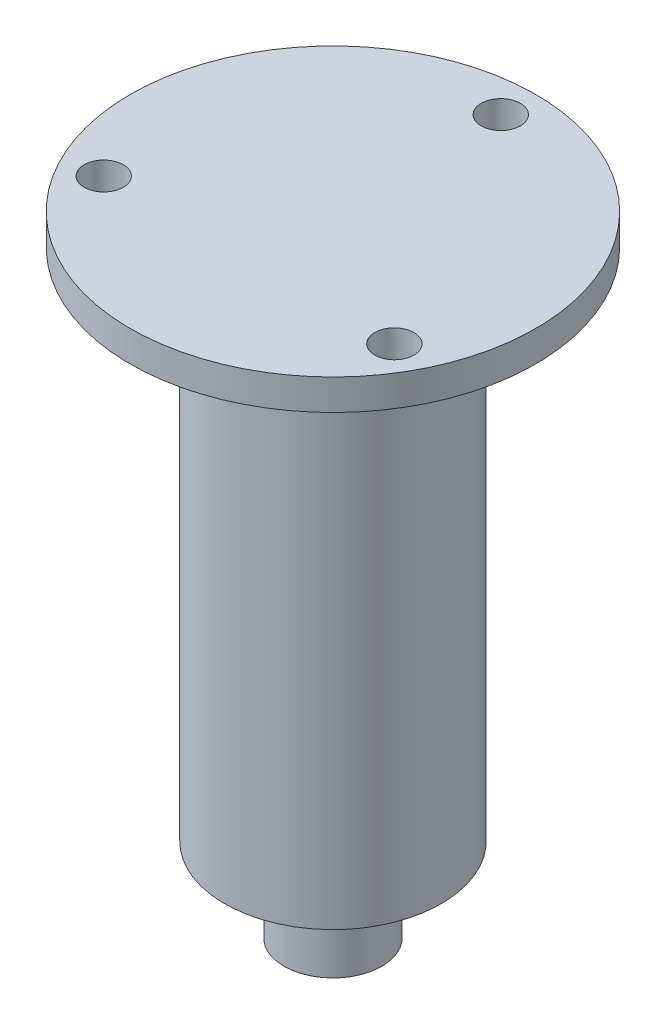
ISO-10303-21;
HEADER;
FILE_DESCRIPTION(('STEP AP214'),'2;1');
FILE_NAME('part.step','',(''),(''),'','','');
FILE_SCHEMA(('AUTOMOTIVE_DESIGN { 1 0 10303 214 1 1 1 1 }'));
ENDSEC;
DATA;
#1=APPLICATION_CONTEXT('core data for automotive mechanical design processes');
#2=APPLICATION_PROTOCOL_DEFINITION('international standard','automotive_design',2000,#1);
#3=PRODUCT_CONTEXT('',#1,'mechanical');
#4=PRODUCT('Part','Part','',(#3));
#5=PRODUCT_RELATED_PRODUCT_CATEGORY('part','',(#4));
#6=PRODUCT_DEFINITION_FORMATION('','',#4);
#7=PRODUCT_DEFINITION_CONTEXT('part definition',#1,'design');
#8=PRODUCT_DEFINITION('design','',#6,#7);
#9=PRODUCT_DEFINITION_SHAPE('','',#8);
#10=(LENGTH_UNIT() NAMED_UNIT(*) SI_UNIT(.MILLI.,.METRE.));
#11=(NAMED_UNIT(*) PLANE_ANGLE_UNIT() SI_UNIT($,.RADIAN.));
#12=(NAMED_UNIT(*) SI_UNIT($,.STERADIAN.) SOLID_ANGLE_UNIT());
#13=UNCERTAINTY_MEASURE_WITH_UNIT(LENGTH_MEASURE(1.E-05),#10,'distance_accuracy_value','');
#14=(GEOMETRIC_REPRESENTATION_CONTEXT(3) GLOBAL_UNCERTAINTY_ASSIGNED_CONTEXT((#13)) GLOBAL_UNIT_ASSIGNED_CONTEXT((#10,
#11,#12)) REPRESENTATION_CONTEXT('',''));
#15=CARTESIAN_POINT('',(0.,0.,0.));
#16=DIRECTION('',(0.,0.,1.));
#17=DIRECTION('',(1.,0.,0.));
#18=AXIS2_PLACEMENT_3D('',#15,#16,#17);
#19=CARTESIAN_POINT('',(0.,0.,0.));
#20=DIRECTION('',(0.,-1.,0.));
#21=DIRECTION('',(1.,0.,0.));
#22=AXIS2_PLACEMENT_3D('',#19,#20,#21);
#23=PLANE('',#22);
#24=CARTESIAN_POINT('',(0.,0.,0.));
#25=DIRECTION('',(0.,1.,0.));
#26=DIRECTION('',(-1.,0.,0.));
#27=AXIS2_PLACEMENT_3D('',#24,#25,#26);
#28=CIRCLE('',#27,3.5);
#29=CARTESIAN_POINT('',(-3.5,0.,0.));
#30=VERTEX_POINT('',#29);
#31=EDGE_CURVE('E10',#30,#30,#28,.T.);
#32=ORIENTED_EDGE('',*,*,#31,.F.);
#33=EDGE_LOOP('',(#32));
#34=FACE_BOUND('',#33,.T.);
#35=ADVANCED_FACE('F41',(#34),#23,.T.);
#36=CARTESIAN_POINT('',(0.,45.,0.));
#37=DIRECTION('',(0.,1.,0.));
#38=DIRECTION('',(-1.,0.,0.));
#39=AXIS2_PLACEMENT_3D('',#36,#37,#38);
#40=CYLINDRICAL_SURFACE('',#39,3.5);
#41=ORIENTED_EDGE('',*,*,#31,.T.);
#42=EDGE_LOOP('',(#41));
#43=FACE_BOUND('',#42,.T.);
#44=CARTESIAN_POINT('',(0.,6.,0.));
#45=DIRECTION('',(0.,1.,0.));
#46=DIRECTION('',(-1.,0.,0.));
#47=AXIS2_PLACEMENT_3D('',#44,#45,#46);
#48=CIRCLE('',#47,3.5);
#49=CARTESIAN_POINT('',(-3.5,6.,0.));
#50=VERTEX_POINT('',#49);
#51=EDGE_CURVE('E47',#50,#50,#48,.T.);
#52=ORIENTED_EDGE('',*,*,#51,.F.);
#53=EDGE_LOOP('',(#52));
#54=FACE_BOUND('',#53,.T.);
#55=ADVANCED_FACE('F111',(#43,#54),#40,.T.);
#56=CARTESIAN_POINT('',(-3.5,6.,0.));
#57=DIRECTION('',(0.,-1.,0.));
#58=DIRECTION('',(1.,0.,0.));
#59=AXIS2_PLACEMENT_3D('',#56,#57,#58);
#60=PLANE('',#59);
#61=ORIENTED_EDGE('',*,*,#51,.T.);
#62=EDGE_LOOP('',(#61));
#63=FACE_BOUND('',#62,.T.);
#64=CARTESIAN_POINT('',(0.,6.,0.));
#65=DIRECTION('',(0.,1.,0.));
#66=DIRECTION('',(-1.,0.,0.));
#67=AXIS2_PLACEMENT_3D('',#64,#65,#66);
#68=CIRCLE('',#67,7.74999999999999);
#69=CARTESIAN_POINT('',(-7.74999999999999,6.,0.));
#70=VERTEX_POINT('',#69);
#71=EDGE_CURVE('E51',#70,#70,#68,.T.);
#72=ORIENTED_EDGE('',*,*,#71,.F.);
#73=EDGE_LOOP('',(#72));
#74=FACE_BOUND('',#73,.T.);
#75=ADVANCED_FACE('F116',(#63,#74),#60,.T.);
#76=CARTESIAN_POINT('',(0.,45.,0.));
#77=DIRECTION('',(0.,1.,0.));
#78=DIRECTION('',(-1.,0.,0.));
#79=AXIS2_PLACEMENT_3D('',#76,#77,#78);
#80=CYLINDRICAL_SURFACE('',#79,7.74999999999999);
#81=ORIENTED_EDGE('',*,*,#71,.T.);
#82=EDGE_LOOP('',(#81));
#83=FACE_BOUND('',#82,.T.);
#84=CARTESIAN_POINT('',(0.,42.8,0.));
#85=DIRECTION('',(0.,1.,0.));
#86=DIRECTION('',(-1.,0.,0.));
#87=AXIS2_PLACEMENT_3D('',#84,#85,#86);
#88=CIRCLE('',#87,7.74999999999999);
#89=CARTESIAN_POINT('',(-7.74999999999999,42.8,0.));
#90=VERTEX_POINT('',#89);
#91=EDGE_CURVE('E55',#90,#90,#88,.T.);
#92=ORIENTED_EDGE('',*,*,#91,.F.);
#93=EDGE_LOOP('',(#92));
#94=FACE_BOUND('',#93,.T.);
#95=ADVANCED_FACE('F107',(#83,#94),#80,.T.);
#96=CARTESIAN_POINT('',(-7.74999999999999,42.8,0.));
#97=DIRECTION('',(0.,-1.,0.));
#98=DIRECTION('',(1.,0.,0.));
#99=AXIS2_PLACEMENT_3D('',#96,#97,#98);
#100=PLANE('',#99);
#101=CARTESIAN_POINT('',(0.,42.8,-12.));
#102=DIRECTION('',(0.,-1.,0.));
#103=DIRECTION('',(1.,0.,0.));
#104=AXIS2_PLACEMENT_3D('',#101,#102,#103);
#105=CIRCLE('',#104,1.4);
#106=CARTESIAN_POINT('',(-1.4,42.8,-12.));
#107=VERTEX_POINT('',#106);
#108=EDGE_CURVE('E66',#107,#107,#105,.T.);
#109=ORIENTED_EDGE('',*,*,#108,.F.);
#110=EDGE_LOOP('',(#109));
#111=FACE_BOUND('',#110,.T.);
#112=CARTESIAN_POINT('',(10.3923048454133,42.8,6.));
#113=DIRECTION('',(0.,-1.,0.));
#114=DIRECTION('',(1.,0.,0.));
#115=AXIS2_PLACEMENT_3D('',#112,#113,#114);
#116=CIRCLE('',#115,1.4);
#117=CARTESIAN_POINT('',(8.99230484541327,42.8,6.));
#118=VERTEX_POINT('',#117);
#119=EDGE_CURVE('E69',#118,#118,#116,.T.);
#120=ORIENTED_EDGE('',*,*,#119,.F.);
#121=EDGE_LOOP('',(#120));
#122=FACE_BOUND('',#121,.T.);
#123=CARTESIAN_POINT('',(-10.3923048454133,42.8,6.));
#124=DIRECTION('',(0.,-1.,0.));
#125=DIRECTION('',(1.,0.,0.));
#126=AXIS2_PLACEMENT_3D('',#123,#124,#125);
#127=CIRCLE('',#126,1.4);
#128=CARTESIAN_POINT('',(-11.7923048454133,42.8,6.));
#129=VERTEX_POINT('',#128);
#130=EDGE_CURVE('E72',#129,#129,#127,.T.);
#131=ORIENTED_EDGE('',*,*,#130,.F.);
#132=EDGE_LOOP('',(#131));
#133=FACE_BOUND('',#132,.T.);
#134=ORIENTED_EDGE('',*,*,#91,.T.);
#135=EDGE_LOOP('',(#134));
#136=FACE_BOUND('',#135,.T.);
#137=CARTESIAN_POINT('',(0.,42.8,0.));
#138=DIRECTION('',(0.,1.,0.));
#139=DIRECTION('',(-1.,0.,0.));
#140=AXIS2_PLACEMENT_3D('',#137,#138,#139);
#141=CIRCLE('',#140,14.5);
#142=CARTESIAN_POINT('',(-14.5,42.8,0.));
#143=VERTEX_POINT('',#142);
#144=EDGE_CURVE('E60',#143,#143,#141,.T.);
#145=ORIENTED_EDGE('',*,*,#144,.F.);
#146=EDGE_LOOP('',(#145));
#147=FACE_BOUND('',#146,.T.);
#148=ADVANCED_FACE('F100',(#111,#122,#133,#136,#147),#100,.T.);
#149=CARTESIAN_POINT('',(0.,45.,0.));
#150=DIRECTION('',(0.,1.,0.));
#151=DIRECTION('',(-1.,0.,0.));
#152=AXIS2_PLACEMENT_3D('',#149,#150,#151);
#153=CYLINDRICAL_SURFACE('',#152,14.5);
#154=ORIENTED_EDGE('',*,*,#144,.T.);
#155=EDGE_LOOP('',(#154));
#156=FACE_BOUND('',#155,.T.);
#157=CARTESIAN_POINT('',(0.,45.,0.));
#158=DIRECTION('',(0.,1.,0.));
#159=DIRECTION('',(-1.,0.,0.));
#160=AXIS2_PLACEMENT_3D('',#157,#158,#159);
#161=CIRCLE('',#160,14.5);
#162=CARTESIAN_POINT('',(-14.5,45.,0.));
#163=VERTEX_POINT('',#162);
#164=EDGE_CURVE('E63',#163,#163,#161,.T.);
#165=ORIENTED_EDGE('',*,*,#164,.F.);
#166=EDGE_LOOP('',(#165));
#167=FACE_BOUND('',#166,.T.);
#168=ADVANCED_FACE('F91',(#156,#167),#153,.T.);
#169=CARTESIAN_POINT('',(-14.5,45.,0.));
#170=DIRECTION('',(0.,1.,0.));
#171=DIRECTION('',(-1.,0.,0.));
#172=AXIS2_PLACEMENT_3D('',#169,#170,#171);
#173=PLANE('',#172);
#174=CARTESIAN_POINT('',(0.,45.,-12.));
#175=DIRECTION('',(0.,1.,0.));
#176=DIRECTION('',(-1.,0.,0.));
#177=AXIS2_PLACEMENT_3D('',#174,#175,#176);
#178=CIRCLE('',#177,1.4);
#179=CARTESIAN_POINT('',(-1.4,45.,-12.));
#180=VERTEX_POINT('',#179);
#181=EDGE_CURVE('E75',#180,#180,#178,.T.);
#182=ORIENTED_EDGE('',*,*,#181,.F.);
#183=EDGE_LOOP('',(#182));
#184=FACE_BOUND('',#183,.T.);
#185=CARTESIAN_POINT('',(10.3923048454133,45.,6.));
#186=DIRECTION('',(0.,1.,0.));
#187=DIRECTION('',(-1.,0.,0.));
#188=AXIS2_PLACEMENT_3D('',#185,#186,#187);
#189=CIRCLE('',#188,1.4);
#190=CARTESIAN_POINT('',(8.99230484541327,45.,6.));
#191=VERTEX_POINT('',#190);
#192=EDGE_CURVE('E79',#191,#191,#189,.T.);
#193=ORIENTED_EDGE('',*,*,#192,.F.);
#194=EDGE_LOOP('',(#193));
#195=FACE_BOUND('',#194,.T.);
#196=CARTESIAN_POINT('',(-10.3923048454133,45.,6.));
#197=DIRECTION('',(0.,1.,0.));
#198=DIRECTION('',(-1.,0.,0.));
#199=AXIS2_PLACEMENT_3D('',#196,#197,#198);
#200=CIRCLE('',#199,1.4);
#201=CARTESIAN_POINT('',(-11.7923048454133,45.,6.));
#202=VERTEX_POINT('',#201);
#203=EDGE_CURVE('E76',#202,#202,#200,.T.);
#204=ORIENTED_EDGE('',*,*,#203,.F.);
#205=EDGE_LOOP('',(#204));
#206=FACE_BOUND('',#205,.T.);
#207=ORIENTED_EDGE('',*,*,#164,.T.);
#208=EDGE_LOOP('',(#207));
#209=FACE_BOUND('',#208,.T.);
#210=ADVANCED_FACE('F87',(#184,#195,#206,#209),#173,.T.);
#211=CARTESIAN_POINT('',(-10.3923048454133,0.,6.));
#212=DIRECTION('',(0.,1.,0.));
#213=DIRECTION('',(-1.,0.,0.));
#214=AXIS2_PLACEMENT_3D('',#211,#212,#213);
#215=CYLINDRICAL_SURFACE('',#214,1.4);
#216=CARTESIAN_POINT('',(-11.7923048454133,42.8,6.));
#217=CARTESIAN_POINT('',(-11.7923048454133,42.8229166666667,6.));
#218=CARTESIAN_POINT('',(-11.7923048454133,42.8458333333333,6.));
#219=CARTESIAN_POINT('',(-11.7923048454133,42.8916666666667,6.));
#220=CARTESIAN_POINT('',(-11.7923048454133,42.9145833333333,6.));
#221=CARTESIAN_POINT('',(-11.7923048454133,42.9604166666667,6.));
#222=CARTESIAN_POINT('',(-11.7923048454133,42.9833333333333,6.));
#223=CARTESIAN_POINT('',(-11.7923048454133,43.0291666666667,6.));
#224=CARTESIAN_POINT('',(-11.7923048454133,43.0520833333333,6.));
#225=CARTESIAN_POINT('',(-11.7923048454133,43.0979166666667,6.));
#226=CARTESIAN_POINT('',(-11.7923048454133,43.1208333333333,6.));
#227=CARTESIAN_POINT('',(-11.7923048454133,43.1666666666667,6.));
#228=CARTESIAN_POINT('',(-11.7923048454133,43.1895833333333,6.));
#229=CARTESIAN_POINT('',(-11.7923048454133,43.2354166666667,6.));
#230=CARTESIAN_POINT('',(-11.7923048454133,43.2583333333333,6.));
#231=CARTESIAN_POINT('',(-11.7923048454133,43.3041666666667,6.));
#232=CARTESIAN_POINT('',(-11.7923048454133,43.3270833333333,6.));
#233=CARTESIAN_POINT('',(-11.7923048454133,43.3729166666667,6.));
#234=CARTESIAN_POINT('',(-11.7923048454133,43.3958333333333,6.));
#235=CARTESIAN_POINT('',(-11.7923048454133,43.4416666666667,6.));
#236=CARTESIAN_POINT('',(-11.7923048454133,43.4645833333333,6.));
#237=CARTESIAN_POINT('',(-11.7923048454133,43.5104166666667,6.));
#238=CARTESIAN_POINT('',(-11.7923048454133,43.5333333333333,6.));
#239=CARTESIAN_POINT('',(-11.7923048454133,43.5791666666667,6.));
#240=CARTESIAN_POINT('',(-11.7923048454133,43.6020833333333,6.));
#241=CARTESIAN_POINT('',(-11.7923048454133,43.6479166666667,6.));
#242=CARTESIAN_POINT('',(-11.7923048454133,43.6708333333333,6.));
#243=CARTESIAN_POINT('',(-11.7923048454133,43.7166666666667,6.));
#244=CARTESIAN_POINT('',(-11.7923048454133,43.7395833333333,6.));
#245=CARTESIAN_POINT('',(-11.7923048454133,43.7854166666667,6.));
#246=CARTESIAN_POINT('',(-11.7923048454133,43.8083333333333,6.));
#247=CARTESIAN_POINT('',(-11.7923048454133,43.8541666666667,6.));
#248=CARTESIAN_POINT('',(-11.7923048454133,43.8770833333333,6.));
#249=CARTESIAN_POINT('',(-11.7923048454133,43.9229166666667,6.));
#250=CARTESIAN_POINT('',(-11.7923048454133,43.9458333333333,6.));
#251=CARTESIAN_POINT('',(-11.7923048454133,43.9916666666667,6.));
#252=CARTESIAN_POINT('',(-11.7923048454133,44.0145833333333,6.));
#253=CARTESIAN_POINT('',(-11.7923048454133,44.0604166666667,6.));
#254=CARTESIAN_POINT('',(-11.7923048454133,44.0833333333333,6.));
#255=CARTESIAN_POINT('',(-11.7923048454133,44.1291666666667,6.));
#256=CARTESIAN_POINT('',(-11.7923048454133,44.1520833333333,6.));
#257=CARTESIAN_POINT('',(-11.7923048454133,44.1979166666667,6.));
#258=CARTESIAN_POINT('',(-11.7923048454133,44.2208333333333,6.));
#259=CARTESIAN_POINT('',(-11.7923048454133,44.2666666666667,6.));
#260=CARTESIAN_POINT('',(-11.7923048454133,44.2895833333333,6.));
#261=CARTESIAN_POINT('',(-11.7923048454133,44.3354166666667,6.));
#262=CARTESIAN_POINT('',(-11.7923048454133,44.3583333333333,6.));
#263=CARTESIAN_POINT('',(-11.7923048454133,44.4041666666667,6.));
#264=CARTESIAN_POINT('',(-11.7923048454133,44.4270833333333,6.));
#265=CARTESIAN_POINT('',(-11.7923048454133,44.4729166666667,6.));
#266=CARTESIAN_POINT('',(-11.7923048454133,44.4958333333333,6.));
#267=CARTESIAN_POINT('',(-11.7923048454133,44.5416666666667,6.));
#268=CARTESIAN_POINT('',(-11.7923048454133,44.5645833333333,6.));
#269=CARTESIAN_POINT('',(-11.7923048454133,44.6104166666667,6.));
#270=CARTESIAN_POINT('',(-11.7923048454133,44.6333333333333,6.));
#271=CARTESIAN_POINT('',(-11.7923048454133,44.6791666666667,6.));
#272=CARTESIAN_POINT('',(-11.7923048454133,44.7020833333333,6.));
#273=CARTESIAN_POINT('',(-11.7923048454133,44.7479166666667,6.));
#274=CARTESIAN_POINT('',(-11.7923048454133,44.7708333333333,6.));
#275=CARTESIAN_POINT('',(-11.7923048454133,44.8166666666667,6.));
#276=CARTESIAN_POINT('',(-11.7923048454133,44.8395833333333,6.));
#277=CARTESIAN_POINT('',(-11.7923048454133,44.8854166666667,6.));
#278=CARTESIAN_POINT('',(-11.7923048454133,44.9083333333333,6.));
#279=CARTESIAN_POINT('',(-11.7923048454133,44.9541666666667,6.));
#280=CARTESIAN_POINT('',(-11.7923048454133,44.9770833333333,6.));
#281=CARTESIAN_POINT('',(-11.7923048454133,45.,6.));
#282=B_SPLINE_CURVE_WITH_KNOTS('',3,(#216,#217,#218,#219,#220,#221,#222,#223,#224,#225,#226,
#227,#228,#229,#230,#231,#232,#233,#234,#235,#236,#237,#238,#239,#240,#241,#242,#243,#244,#245,
#246,#247,#248,#249,#250,#251,#252,#253,#254,#255,#256,#257,#258,#259,#260,#261,#262,#263,#264,
#265,#266,#267,#268,#269,#270,#271,#272,#273,#274,#275,#276,#277,#278,#279,#280,#281),
.UNSPECIFIED.,.F.,.F.,(4,2,2,2,2,2,2,2,2,2,2,2,2,2,2,2,2,2,2,2,2,2,2,2,2,2,2,2,2,2,2,2,4),(0.,
0.0687499999999994,0.137499999999999,0.206249999999998,0.274999999999997,0.343749999999997,
0.412499999999996,0.481249999999996,0.549999999999995,0.618750000000001,0.687500000000001,
0.75625,0.824999999999999,0.893749999999999,0.962499999999998,1.03125,1.1,1.16875,1.2375,
1.30625,1.37499999999999,1.44374999999999,1.51249999999999,1.58124999999999,1.65,1.71875,1.7875,
1.85625,1.925,1.99375,2.06249999999999,2.13124999999999,2.19999999999999),.UNSPECIFIED.);
#283=EDGE_CURVE('BSEAM90',#129,#202,#282,.T.);
#284=ORIENTED_EDGE('',*,*,#130,.T.);
#285=ORIENTED_EDGE('',*,*,#203,.T.);
#286=ORIENTED_EDGE('',*,*,#283,.T.);
#287=ORIENTED_EDGE('',*,*,#283,.F.);
#288=EDGE_LOOP('',(#284,#286,#285,#287));
#289=FACE_BOUND('',#288,.T.);
#290=ADVANCED_FACE('F90',(#289),#215,.F.);
#291=CARTESIAN_POINT('',(10.3923048454133,0.,6.));
#292=DIRECTION('',(0.,1.,0.));
#293=DIRECTION('',(-1.,0.,0.));
#294=AXIS2_PLACEMENT_3D('',#291,#292,#293);
#295=CYLINDRICAL_SURFACE('',#294,1.4);
#296=CARTESIAN_POINT('',(8.99230484541327,42.8,6.));
#297=CARTESIAN_POINT('',(8.99230484541327,42.8229166666667,6.));
#298=CARTESIAN_POINT('',(8.99230484541327,42.8458333333333,6.));
#299=CARTESIAN_POINT('',(8.99230484541327,42.8916666666667,6.));
#300=CARTESIAN_POINT('',(8.99230484541327,42.9145833333333,6.));
#301=CARTESIAN_POINT('',(8.99230484541327,42.9604166666667,6.));
#302=CARTESIAN_POINT('',(8.99230484541327,42.9833333333333,6.));
#303=CARTESIAN_POINT('',(8.99230484541327,43.0291666666667,6.));
#304=CARTESIAN_POINT('',(8.99230484541327,43.0520833333333,6.));
#305=CARTESIAN_POINT('',(8.99230484541327,43.0979166666667,6.));
#306=CARTESIAN_POINT('',(8.99230484541327,43.1208333333333,6.));
#307=CARTESIAN_POINT('',(8.99230484541327,43.1666666666667,6.));
#308=CARTESIAN_POINT('',(8.99230484541327,43.1895833333333,6.));
#309=CARTESIAN_POINT('',(8.99230484541327,43.2354166666667,6.));
#310=CARTESIAN_POINT('',(8.99230484541327,43.2583333333333,6.));
#311=CARTESIAN_POINT('',(8.99230484541327,43.3041666666667,6.));
#312=CARTESIAN_POINT('',(8.99230484541327,43.3270833333333,6.));
#313=CARTESIAN_POINT('',(8.99230484541327,43.3729166666667,6.));
#314=CARTESIAN_POINT('',(8.99230484541327,43.3958333333333,6.));
#315=CARTESIAN_POINT('',(8.99230484541327,43.4416666666667,6.));
#316=CARTESIAN_POINT('',(8.99230484541327,43.4645833333333,6.));
#317=CARTESIAN_POINT('',(8.99230484541327,43.5104166666667,6.));
#318=CARTESIAN_POINT('',(8.99230484541327,43.5333333333333,6.));
#319=CARTESIAN_POINT('',(8.99230484541327,43.5791666666667,6.));
#320=CARTESIAN_POINT('',(8.99230484541327,43.6020833333333,6.));
#321=CARTESIAN_POINT('',(8.99230484541327,43.6479166666667,6.));
#322=CARTESIAN_POINT('',(8.99230484541327,43.6708333333333,6.));
#323=CARTESIAN_POINT('',(8.99230484541327,43.7166666666667,6.));
#324=CARTESIAN_POINT('',(8.99230484541327,43.7395833333333,6.));
#325=CARTESIAN_POINT('',(8.99230484541327,43.7854166666667,6.));
#326=CARTESIAN_POINT('',(8.99230484541327,43.8083333333333,6.));
#327=CARTESIAN_POINT('',(8.99230484541327,43.8541666666667,6.));
#328=CARTESIAN_POINT('',(8.99230484541327,43.8770833333333,6.));
#329=CARTESIAN_POINT('',(8.99230484541327,43.9229166666667,6.));
#330=CARTESIAN_POINT('',(8.99230484541327,43.9458333333333,6.));
#331=CARTESIAN_POINT('',(8.99230484541327,43.9916666666667,6.));
#332=CARTESIAN_POINT('',(8.99230484541327,44.0145833333333,6.));
#333=CARTESIAN_POINT('',(8.99230484541327,44.0604166666667,6.));
#334=CARTESIAN_POINT('',(8.99230484541327,44.0833333333333,6.));
#335=CARTESIAN_POINT('',(8.99230484541327,44.1291666666667,6.));
#336=CARTESIAN_POINT('',(8.99230484541327,44.1520833333333,6.));
#337=CARTESIAN_POINT('',(8.99230484541327,44.1979166666667,6.));
#338=CARTESIAN_POINT('',(8.99230484541327,44.2208333333333,6.));
#339=CARTESIAN_POINT('',(8.99230484541327,44.2666666666667,6.));
#340=CARTESIAN_POINT('',(8.99230484541327,44.2895833333333,6.));
#341=CARTESIAN_POINT('',(8.99230484541327,44.3354166666667,6.));
#342=CARTESIAN_POINT('',(8.99230484541327,44.3583333333333,6.));
#343=CARTESIAN_POINT('',(8.99230484541327,44.4041666666667,6.));
#344=CARTESIAN_POINT('',(8.99230484541327,44.4270833333333,6.));
#345=CARTESIAN_POINT('',(8.99230484541327,44.4729166666667,6.));
#346=CARTESIAN_POINT('',(8.99230484541327,44.4958333333333,6.));
#347=CARTESIAN_POINT('',(8.99230484541327,44.5416666666667,6.));
#348=CARTESIAN_POINT('',(8.99230484541327,44.5645833333333,6.));
#349=CARTESIAN_POINT('',(8.99230484541327,44.6104166666667,6.));
#350=CARTESIAN_POINT('',(8.99230484541327,44.6333333333333,6.));
#351=CARTESIAN_POINT('',(8.99230484541327,44.6791666666667,6.));
#352=CARTESIAN_POINT('',(8.99230484541327,44.7020833333333,6.));
#353=CARTESIAN_POINT('',(8.99230484541327,44.7479166666667,6.));
#354=CARTESIAN_POINT('',(8.99230484541327,44.7708333333333,6.));
#355=CARTESIAN_POINT('',(8.99230484541327,44.8166666666667,6.));
#356=CARTESIAN_POINT('',(8.99230484541327,44.8395833333333,6.));
#357=CARTESIAN_POINT('',(8.99230484541327,44.8854166666667,6.));
#358=CARTESIAN_POINT('',(8.99230484541327,44.9083333333333,6.));
#359=CARTESIAN_POINT('',(8.99230484541327,44.9541666666667,6.));
#360=CARTESIAN_POINT('',(8.99230484541327,44.9770833333333,6.));
#361=CARTESIAN_POINT('',(8.99230484541327,45.,6.));
#362=B_SPLINE_CURVE_WITH_KNOTS('',3,(#296,#297,#298,#299,#300,#301,#302,#303,#304,#305,#306,
#307,#308,#309,#310,#311,#312,#313,#314,#315,#316,#317,#318,#319,#320,#321,#322,#323,#324,#325,
#326,#327,#328,#329,#330,#331,#332,#333,#334,#335,#336,#337,#338,#339,#340,#341,#342,#343,#344,
#345,#346,#347,#348,#349,#350,#351,#352,#353,#354,#355,#356,#357,#358,#359,#360,#361),
.UNSPECIFIED.,.F.,.F.,(4,2,2,2,2,2,2,2,2,2,2,2,2,2,2,2,2,2,2,2,2,2,2,2,2,2,2,2,2,2,2,2,4),(0.,
0.0687499999999994,0.137499999999999,0.206249999999998,0.274999999999997,0.343749999999997,
0.412499999999996,0.481249999999996,0.549999999999995,0.618750000000001,0.687500000000001,
0.75625,0.824999999999999,0.893749999999999,0.962499999999998,1.03125,1.1,1.16875,1.2375,
1.30625,1.37499999999999,1.44374999999999,1.51249999999999,1.58124999999999,1.65,1.71875,1.7875,
1.85625,1.925,1.99375,2.06249999999999,2.13124999999999,2.19999999999999),.UNSPECIFIED.);
#363=EDGE_CURVE('BSEAM171',#118,#191,#362,.T.);
#364=ORIENTED_EDGE('',*,*,#119,.T.);
#365=ORIENTED_EDGE('',*,*,#192,.T.);
#366=ORIENTED_EDGE('',*,*,#363,.T.);
#367=ORIENTED_EDGE('',*,*,#363,.F.);
#368=EDGE_LOOP('',(#364,#366,#365,#367));
#369=FACE_BOUND('',#368,.T.);
#370=ADVANCED_FACE('F171',(#369),#295,.F.);
#371=CARTESIAN_POINT('',(0.,0.,-12.));
#372=DIRECTION('',(0.,1.,0.));
#373=DIRECTION('',(-1.,0.,0.));
#374=AXIS2_PLACEMENT_3D('',#371,#372,#373);
#375=CYLINDRICAL_SURFACE('',#374,1.4);
#376=CARTESIAN_POINT('',(-1.4,42.8,-12.));
#377=CARTESIAN_POINT('',(-1.4,42.8229166666667,-12.));
#378=CARTESIAN_POINT('',(-1.4,42.8458333333333,-12.));
#379=CARTESIAN_POINT('',(-1.4,42.8916666666667,-12.));
#380=CARTESIAN_POINT('',(-1.4,42.9145833333333,-12.));
#381=CARTESIAN_POINT('',(-1.4,42.9604166666667,-12.));
#382=CARTESIAN_POINT('',(-1.4,42.9833333333333,-12.));
#383=CARTESIAN_POINT('',(-1.4,43.0291666666667,-12.));
#384=CARTESIAN_POINT('',(-1.4,43.0520833333333,-12.));
#385=CARTESIAN_POINT('',(-1.4,43.0979166666667,-12.));
#386=CARTESIAN_POINT('',(-1.4,43.1208333333333,-12.));
#387=CARTESIAN_POINT('',(-1.4,43.1666666666667,-12.));
#388=CARTESIAN_POINT('',(-1.4,43.1895833333333,-12.));
#389=CARTESIAN_POINT('',(-1.4,43.2354166666667,-12.));
#390=CARTESIAN_POINT('',(-1.4,43.2583333333333,-12.));
#391=CARTESIAN_POINT('',(-1.4,43.3041666666667,-12.));
#392=CARTESIAN_POINT('',(-1.4,43.3270833333333,-12.));
#393=CARTESIAN_POINT('',(-1.4,43.3729166666667,-12.));
#394=CARTESIAN_POINT('',(-1.4,43.3958333333333,-12.));
#395=CARTESIAN_POINT('',(-1.4,43.4416666666667,-12.));
#396=CARTESIAN_POINT('',(-1.4,43.4645833333333,-12.));
#397=CARTESIAN_POINT('',(-1.4,43.5104166666667,-12.));
#398=CARTESIAN_POINT('',(-1.4,43.5333333333333,-12.));
#399=CARTESIAN_POINT('',(-1.4,43.5791666666667,-12.));
#400=CARTESIAN_POINT('',(-1.4,43.6020833333333,-12.));
#401=CARTESIAN_POINT('',(-1.4,43.6479166666667,-12.));
#402=CARTESIAN_POINT('',(-1.4,43.6708333333333,-12.));
#403=CARTESIAN_POINT('',(-1.4,43.7166666666667,-12.));
#404=CARTESIAN_POINT('',(-1.4,43.7395833333333,-12.));
#405=CARTESIAN_POINT('',(-1.4,43.7854166666667,-12.));
#406=CARTESIAN_POINT('',(-1.4,43.8083333333333,-12.));
#407=CARTESIAN_POINT('',(-1.4,43.8541666666667,-12.));
#408=CARTESIAN_POINT('',(-1.4,43.8770833333333,-12.));
#409=CARTESIAN_POINT('',(-1.4,43.9229166666667,-12.));
#410=CARTESIAN_POINT('',(-1.4,43.9458333333333,-12.));
#411=CARTESIAN_POINT('',(-1.4,43.9916666666667,-12.));
#412=CARTESIAN_POINT('',(-1.4,44.0145833333333,-12.));
#413=CARTESIAN_POINT('',(-1.4,44.0604166666667,-12.));
#414=CARTESIAN_POINT('',(-1.4,44.0833333333333,-12.));
#415=CARTESIAN_POINT('',(-1.4,44.1291666666667,-12.));
#416=CARTESIAN_POINT('',(-1.4,44.1520833333333,-12.));
#417=CARTESIAN_POINT('',(-1.4,44.1979166666667,-12.));
#418=CARTESIAN_POINT('',(-1.4,44.2208333333333,-12.));
#419=CARTESIAN_POINT('',(-1.4,44.2666666666667,-12.));
#420=CARTESIAN_POINT('',(-1.4,44.2895833333333,-12.));
#421=CARTESIAN_POINT('',(-1.4,44.3354166666667,-12.));
#422=CARTESIAN_POINT('',(-1.4,44.3583333333333,-12.));
#423=CARTESIAN_POINT('',(-1.4,44.4041666666667,-12.));
#424=CARTESIAN_POINT('',(-1.4,44.4270833333333,-12.));
#425=CARTESIAN_POINT('',(-1.4,44.4729166666667,-12.));
#426=CARTESIAN_POINT('',(-1.4,44.4958333333333,-12.));
#427=CARTESIAN_POINT('',(-1.4,44.5416666666667,-12.));
#428=CARTESIAN_POINT('',(-1.4,44.5645833333333,-12.));
#429=CARTESIAN_POINT('',(-1.4,44.6104166666667,-12.));
#430=CARTESIAN_POINT('',(-1.4,44.6333333333333,-12.));
#431=CARTESIAN_POINT('',(-1.4,44.6791666666667,-12.));
#432=CARTESIAN_POINT('',(-1.4,44.7020833333333,-12.));
#433=CARTESIAN_POINT('',(-1.4,44.7479166666667,-12.));
#434=CARTESIAN_POINT('',(-1.4,44.7708333333333,-12.));
#435=CARTESIAN_POINT('',(-1.4,44.8166666666667,-12.));
#436=CARTESIAN_POINT('',(-1.4,44.8395833333333,-12.));
#437=CARTESIAN_POINT('',(-1.4,44.8854166666667,-12.));
#438=CARTESIAN_POINT('',(-1.4,44.9083333333333,-12.));
#439=CARTESIAN_POINT('',(-1.4,44.9541666666667,-12.));
#440=CARTESIAN_POINT('',(-1.4,44.9770833333333,-12.));
#441=CARTESIAN_POINT('',(-1.4,45.,-12.));
#442=B_SPLINE_CURVE_WITH_KNOTS('',3,(#376,#377,#378,#379,#380,#381,#382,#383,#384,#385,#386,
#387,#388,#389,#390,#391,#392,#393,#394,#395,#396,#397,#398,#399,#400,#401,#402,#403,#404,#405,
#406,#407,#408,#409,#410,#411,#412,#413,#414,#415,#416,#417,#418,#419,#420,#421,#422,#423,#424,
#425,#426,#427,#428,#429,#430,#431,#432,#433,#434,#435,#436,#437,#438,#439,#440,#441),
.UNSPECIFIED.,.F.,.F.,(4,2,2,2,2,2,2,2,2,2,2,2,2,2,2,2,2,2,2,2,2,2,2,2,2,2,2,2,2,2,2,2,4),(0.,
0.0687499999999994,0.137499999999999,0.206249999999998,0.274999999999997,0.343749999999997,
0.412499999999996,0.481249999999996,0.549999999999995,0.618750000000001,0.687500000000001,
0.75625,0.824999999999999,0.893749999999999,0.962499999999998,1.03125,1.1,1.16875,1.2375,
1.30625,1.37499999999999,1.44374999999999,1.51249999999999,1.58124999999999,1.65,1.71875,1.7875,
1.85625,1.925,1.99375,2.06249999999999,2.13124999999999,2.19999999999999),.UNSPECIFIED.);
#443=EDGE_CURVE('BSEAM85',#107,#180,#442,.T.);
#444=ORIENTED_EDGE('',*,*,#108,.T.);
#445=ORIENTED_EDGE('',*,*,#181,.T.);
#446=ORIENTED_EDGE('',*,*,#443,.T.);
#447=ORIENTED_EDGE('',*,*,#443,.F.);
#448=EDGE_LOOP('',(#444,#446,#445,#447));
#449=FACE_BOUND('',#448,.T.);
#450=ADVANCED_FACE('F85',(#449),#375,.F.);
#451=CLOSED_SHELL('',(#35,#55,#75,#95,#148,#168,#210,#290,#370,#450));
#452=MANIFOLD_SOLID_BREP('B2',#451);
#453=ADVANCED_BREP_SHAPE_REPRESENTATION('',(#18,#452),#14);
#454=SHAPE_DEFINITION_REPRESENTATION(#9,#453);
ENDSEC;
END-ISO-10303-21;
